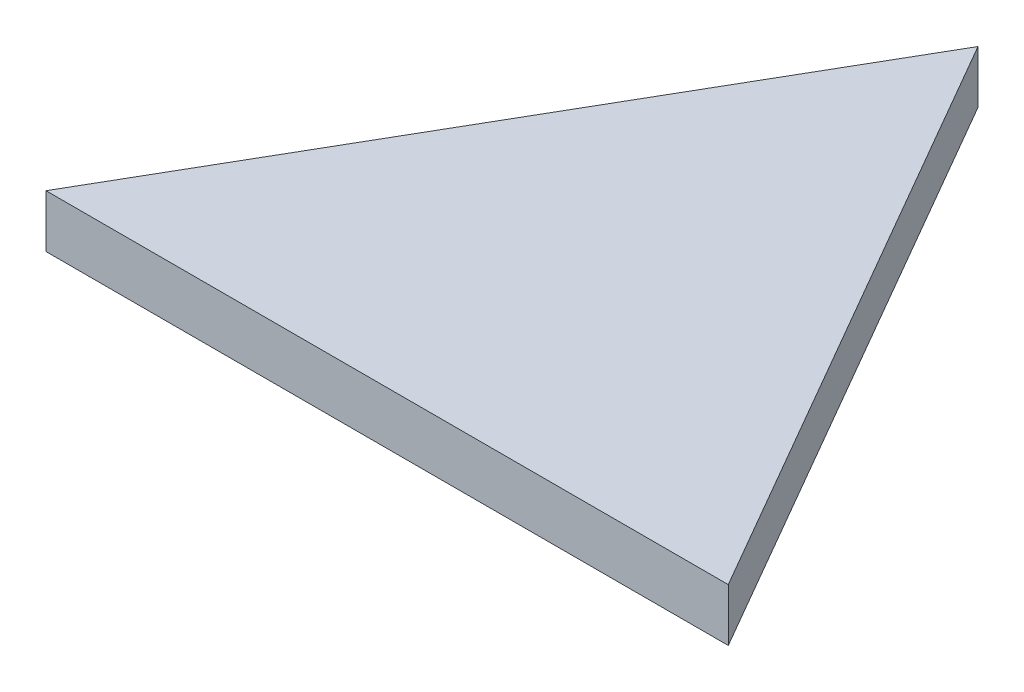
ISO-10303-21;
HEADER;
FILE_DESCRIPTION(('STEP AP214'),'2;1');
FILE_NAME('part.step','',(''),(''),'','','');
FILE_SCHEMA(('AUTOMOTIVE_DESIGN { 1 0 10303 214 1 1 1 1 }'));
ENDSEC;
DATA;
#1=APPLICATION_CONTEXT('core data for automotive mechanical design processes');
#2=APPLICATION_PROTOCOL_DEFINITION('international standard','automotive_design',2000,#1);
#3=PRODUCT_CONTEXT('',#1,'mechanical');
#4=PRODUCT('Part','Part','',(#3));
#5=PRODUCT_RELATED_PRODUCT_CATEGORY('part','',(#4));
#6=PRODUCT_DEFINITION_FORMATION('','',#4);
#7=PRODUCT_DEFINITION_CONTEXT('part definition',#1,'design');
#8=PRODUCT_DEFINITION('design','',#6,#7);
#9=PRODUCT_DEFINITION_SHAPE('','',#8);
#10=(LENGTH_UNIT() NAMED_UNIT(*) SI_UNIT(.MILLI.,.METRE.));
#11=(NAMED_UNIT(*) PLANE_ANGLE_UNIT() SI_UNIT($,.RADIAN.));
#12=(NAMED_UNIT(*) SI_UNIT($,.STERADIAN.) SOLID_ANGLE_UNIT());
#13=UNCERTAINTY_MEASURE_WITH_UNIT(LENGTH_MEASURE(1.E-05),#10,'distance_accuracy_value','');
#14=(GEOMETRIC_REPRESENTATION_CONTEXT(3) GLOBAL_UNCERTAINTY_ASSIGNED_CONTEXT((#13)) GLOBAL_UNIT_ASSIGNED_CONTEXT((#10,
#11,#12)) REPRESENTATION_CONTEXT('',''));
#15=CARTESIAN_POINT('',(0.,0.,0.));
#16=DIRECTION('',(0.,0.,1.));
#17=DIRECTION('',(1.,0.,0.));
#18=AXIS2_PLACEMENT_3D('',#15,#16,#17);
#19=CARTESIAN_POINT('',(68.4167130490525,17.,39.8507649226201));
#20=DIRECTION('',(-0.866025403784439,0.,0.5));
#21=DIRECTION('',(0.5,0.,0.866025403784439));
#22=AXIS2_PLACEMENT_3D('',#19,#20,#21);
#23=PLANE('',#22);
#24=DIRECTION('',(-0.5,0.,-0.866025403784439));
#25=VECTOR('',#24,1.);
#26=CARTESIAN_POINT('',(68.4167130490525,0.,39.8507649226201));
#27=LINE('',#26,#25);
#28=CARTESIAN_POINT('',(68.4167130490525,0.,39.8507649226201));
#29=VERTEX_POINT('',#28);
#30=CARTESIAN_POINT('',(-41.5832869509475,0.,-150.674823909956));
#31=VERTEX_POINT('',#30);
#32=EDGE_CURVE('E82',#29,#31,#27,.T.);
#33=ORIENTED_EDGE('',*,*,#32,.T.);
#34=DIRECTION('',(0.,-1.,0.));
#35=VECTOR('',#34,1.);
#36=CARTESIAN_POINT('',(-41.5832869509475,17.,-150.674823909956));
#37=LINE('',#36,#35);
#38=CARTESIAN_POINT('',(-41.5832869509475,17.,-150.674823909956));
#39=VERTEX_POINT('',#38);
#40=EDGE_CURVE('E11',#39,#31,#37,.T.);
#41=ORIENTED_EDGE('',*,*,#40,.F.);
#42=DIRECTION('',(-0.5,0.,-0.866025403784439));
#43=VECTOR('',#42,1.);
#44=CARTESIAN_POINT('',(68.4167130490525,17.,39.8507649226201));
#45=LINE('',#44,#43);
#46=CARTESIAN_POINT('',(68.4167130490525,17.,39.8507649226201));
#47=VERTEX_POINT('',#46);
#48=EDGE_CURVE('E75',#47,#39,#45,.T.);
#49=ORIENTED_EDGE('',*,*,#48,.F.);
#50=DIRECTION('',(0.,-1.,0.));
#51=VECTOR('',#50,1.);
#52=CARTESIAN_POINT('',(68.4167130490525,17.,39.8507649226201));
#53=LINE('',#52,#51);
#54=EDGE_CURVE('E83',#47,#29,#53,.T.);
#55=ORIENTED_EDGE('',*,*,#54,.T.);
#56=EDGE_LOOP('',(#33,#41,#49,#55));
#57=FACE_BOUND('',#56,.T.);
#58=ADVANCED_FACE('F35',(#57),#23,.F.);
#59=CARTESIAN_POINT('',(-41.5832869509475,17.,-150.674823909956));
#60=DIRECTION('',(0.866025403784439,0.,0.5));
#61=DIRECTION('',(0.5,0.,-0.866025403784439));
#62=AXIS2_PLACEMENT_3D('',#59,#60,#61);
#63=PLANE('',#62);
#64=DIRECTION('',(-0.5,0.,0.866025403784439));
#65=VECTOR('',#64,1.);
#66=CARTESIAN_POINT('',(-41.5832869509475,0.,-150.674823909956));
#67=LINE('',#66,#65);
#68=CARTESIAN_POINT('',(-151.583286950947,0.,39.8507649226201));
#69=VERTEX_POINT('',#68);
#70=EDGE_CURVE('E63',#31,#69,#67,.T.);
#71=ORIENTED_EDGE('',*,*,#70,.T.);
#72=DIRECTION('',(0.,-1.,0.));
#73=VECTOR('',#72,1.);
#74=CARTESIAN_POINT('',(-151.583286950947,17.,39.8507649226201));
#75=LINE('',#74,#73);
#76=CARTESIAN_POINT('',(-151.583286950947,17.,39.8507649226201));
#77=VERTEX_POINT('',#76);
#78=EDGE_CURVE('E43',#77,#69,#75,.T.);
#79=ORIENTED_EDGE('',*,*,#78,.F.);
#80=DIRECTION('',(-0.5,0.,0.866025403784439));
#81=VECTOR('',#80,1.);
#82=CARTESIAN_POINT('',(-41.5832869509475,17.,-150.674823909956));
#83=LINE('',#82,#81);
#84=EDGE_CURVE('E71',#39,#77,#83,.T.);
#85=ORIENTED_EDGE('',*,*,#84,.F.);
#86=ORIENTED_EDGE('',*,*,#40,.T.);
#87=EDGE_LOOP('',(#71,#79,#85,#86));
#88=FACE_BOUND('',#87,.T.);
#89=ADVANCED_FACE('F72',(#88),#63,.F.);
#90=CARTESIAN_POINT('',(-151.583286950947,17.,39.8507649226201));
#91=DIRECTION('',(0.,0.,-1.));
#92=DIRECTION('',(-1.,0.,0.));
#93=AXIS2_PLACEMENT_3D('',#90,#91,#92);
#94=PLANE('',#93);
#95=DIRECTION('',(1.,0.,0.));
#96=VECTOR('',#95,1.);
#97=CARTESIAN_POINT('',(-151.583286950947,0.,39.8507649226201));
#98=LINE('',#97,#96);
#99=EDGE_CURVE('E68',#69,#29,#98,.T.);
#100=ORIENTED_EDGE('',*,*,#99,.T.);
#101=ORIENTED_EDGE('',*,*,#54,.F.);
#102=DIRECTION('',(1.,0.,0.));
#103=VECTOR('',#102,1.);
#104=CARTESIAN_POINT('',(-151.583286950947,17.,39.8507649226201));
#105=LINE('',#104,#103);
#106=EDGE_CURVE('E51',#77,#47,#105,.T.);
#107=ORIENTED_EDGE('',*,*,#106,.F.);
#108=ORIENTED_EDGE('',*,*,#78,.T.);
#109=EDGE_LOOP('',(#100,#101,#107,#108));
#110=FACE_BOUND('',#109,.T.);
#111=ADVANCED_FACE('F94',(#110),#94,.F.);
#112=CARTESIAN_POINT('',(0.,17.,0.));
#113=DIRECTION('',(0.,1.,0.));
#114=DIRECTION('',(0.,0.,1.));
#115=AXIS2_PLACEMENT_3D('',#112,#113,#114);
#116=PLANE('',#115);
#117=ORIENTED_EDGE('',*,*,#48,.T.);
#118=ORIENTED_EDGE('',*,*,#84,.T.);
#119=ORIENTED_EDGE('',*,*,#106,.T.);
#120=EDGE_LOOP('',(#117,#118,#119));
#121=FACE_BOUND('',#120,.T.);
#122=ADVANCED_FACE('F78',(#121),#116,.T.);
#123=CARTESIAN_POINT('',(0.,0.,0.));
#124=DIRECTION('',(0.,1.,0.));
#125=DIRECTION('',(0.,0.,1.));
#126=AXIS2_PLACEMENT_3D('',#123,#124,#125);
#127=PLANE('',#126);
#128=CARTESIAN_POINT('',(-145.521109124456,0.,36.3507649226202));
#129=DIRECTION('',(0.,-1.,0.));
#130=DIRECTION('',(0.,0.,-1.));
#131=AXIS2_PLACEMENT_3D('',#128,#129,#130);
#132=CIRCLE('',#131,2.);
#133=CARTESIAN_POINT('',(-145.521109124456,0.,34.3507649226202));
#134=VERTEX_POINT('',#133);
#135=EDGE_CURVE('E89',#134,#134,#132,.T.);
#136=ORIENTED_EDGE('',*,*,#135,.F.);
#137=EDGE_LOOP('',(#136));
#138=FACE_BOUND('',#137,.T.);
#139=CARTESIAN_POINT('',(62.3545352225615,0.,36.3507649226201));
#140=DIRECTION('',(0.,-1.,0.));
#141=DIRECTION('',(0.,0.,-1.));
#142=AXIS2_PLACEMENT_3D('',#139,#140,#141);
#143=CIRCLE('',#142,2.);
#144=CARTESIAN_POINT('',(62.3545352225615,0.,34.3507649226201));
#145=VERTEX_POINT('',#144);
#146=EDGE_CURVE('E193',#145,#145,#143,.T.);
#147=ORIENTED_EDGE('',*,*,#146,.F.);
#148=EDGE_LOOP('',(#147));
#149=FACE_BOUND('',#148,.T.);
#150=CARTESIAN_POINT('',(-41.5832869509475,0.,-143.674823909956));
#151=DIRECTION('',(0.,-1.,0.));
#152=DIRECTION('',(0.,0.,-1.));
#153=AXIS2_PLACEMENT_3D('',#150,#151,#152);
#154=CIRCLE('',#153,2.);
#155=CARTESIAN_POINT('',(-41.5832869509475,0.,-145.674823909956));
#156=VERTEX_POINT('',#155);
#157=EDGE_CURVE('E201',#156,#156,#154,.T.);
#158=ORIENTED_EDGE('',*,*,#157,.F.);
#159=EDGE_LOOP('',(#158));
#160=FACE_BOUND('',#159,.T.);
#161=ORIENTED_EDGE('',*,*,#32,.F.);
#162=ORIENTED_EDGE('',*,*,#99,.F.);
#163=ORIENTED_EDGE('',*,*,#70,.F.);
#164=EDGE_LOOP('',(#161,#162,#163));
#165=FACE_BOUND('',#164,.T.);
#166=ADVANCED_FACE('F95',(#138,#149,#160,#165),#127,.F.);
#167=CARTESIAN_POINT('',(-41.5832869509475,14.,-143.674823909956));
#168=DIRECTION('',(0.,-1.,0.));
#169=DIRECTION('',(0.,0.,-1.));
#170=AXIS2_PLACEMENT_3D('',#167,#168,#169);
#171=CYLINDRICAL_SURFACE('',#170,2.);
#172=CARTESIAN_POINT('',(-41.5832869509475,14.,-143.674823909956));
#173=DIRECTION('',(0.,-1.,0.));
#174=DIRECTION('',(0.,0.,-1.));
#175=AXIS2_PLACEMENT_3D('',#172,#173,#174);
#176=CIRCLE('',#175,2.);
#177=CARTESIAN_POINT('',(-41.5832869509475,14.,-145.674823909956));
#178=VERTEX_POINT('',#177);
#179=EDGE_CURVE('E198',#178,#178,#176,.T.);
#180=ORIENTED_EDGE('',*,*,#179,.F.);
#181=EDGE_LOOP('',(#180));
#182=FACE_BOUND('',#181,.T.);
#183=ORIENTED_EDGE('',*,*,#157,.T.);
#184=EDGE_LOOP('',(#183));
#185=FACE_BOUND('',#184,.T.);
#186=ADVANCED_FACE('F97',(#182,#185),#171,.F.);
#187=CARTESIAN_POINT('',(-41.5832869509475,14.,-143.674823909956));
#188=DIRECTION('',(0.,-1.,0.));
#189=DIRECTION('',(0.,0.,-1.));
#190=AXIS2_PLACEMENT_3D('',#187,#188,#189);
#191=PLANE('',#190);
#192=ORIENTED_EDGE('',*,*,#179,.T.);
#193=EDGE_LOOP('',(#192));
#194=FACE_BOUND('',#193,.T.);
#195=ADVANCED_FACE('F104',(#194),#191,.T.);
#196=CARTESIAN_POINT('',(62.3545352225615,14.,36.3507649226201));
#197=DIRECTION('',(0.,-1.,0.));
#198=DIRECTION('',(0.,0.,-1.));
#199=AXIS2_PLACEMENT_3D('',#196,#197,#198);
#200=CYLINDRICAL_SURFACE('',#199,2.);
#201=CARTESIAN_POINT('',(62.3545352225615,14.,36.3507649226201));
#202=DIRECTION('',(0.,-1.,0.));
#203=DIRECTION('',(0.,0.,-1.));
#204=AXIS2_PLACEMENT_3D('',#201,#202,#203);
#205=CIRCLE('',#204,2.);
#206=CARTESIAN_POINT('',(62.3545352225615,14.,34.3507649226201));
#207=VERTEX_POINT('',#206);
#208=EDGE_CURVE('E190',#207,#207,#205,.T.);
#209=ORIENTED_EDGE('',*,*,#208,.F.);
#210=EDGE_LOOP('',(#209));
#211=FACE_BOUND('',#210,.T.);
#212=ORIENTED_EDGE('',*,*,#146,.T.);
#213=EDGE_LOOP('',(#212));
#214=FACE_BOUND('',#213,.T.);
#215=ADVANCED_FACE('F143',(#211,#214),#200,.F.);
#216=CARTESIAN_POINT('',(62.3545352225615,14.,36.3507649226201));
#217=DIRECTION('',(0.,-1.,0.));
#218=DIRECTION('',(0.,0.,-1.));
#219=AXIS2_PLACEMENT_3D('',#216,#217,#218);
#220=PLANE('',#219);
#221=ORIENTED_EDGE('',*,*,#208,.T.);
#222=EDGE_LOOP('',(#221));
#223=FACE_BOUND('',#222,.T.);
#224=ADVANCED_FACE('F153',(#223),#220,.T.);
#225=CARTESIAN_POINT('',(-145.521109124456,14.,36.3507649226202));
#226=DIRECTION('',(0.,-1.,0.));
#227=DIRECTION('',(0.,0.,-1.));
#228=AXIS2_PLACEMENT_3D('',#225,#226,#227);
#229=CYLINDRICAL_SURFACE('',#228,2.);
#230=CARTESIAN_POINT('',(-145.521109124456,14.,36.3507649226202));
#231=DIRECTION('',(0.,-1.,0.));
#232=DIRECTION('',(0.,0.,-1.));
#233=AXIS2_PLACEMENT_3D('',#230,#231,#232);
#234=CIRCLE('',#233,2.);
#235=CARTESIAN_POINT('',(-145.521109124456,14.,34.3507649226202));
#236=VERTEX_POINT('',#235);
#237=EDGE_CURVE('E85',#236,#236,#234,.T.);
#238=ORIENTED_EDGE('',*,*,#237,.F.);
#239=EDGE_LOOP('',(#238));
#240=FACE_BOUND('',#239,.T.);
#241=ORIENTED_EDGE('',*,*,#135,.T.);
#242=EDGE_LOOP('',(#241));
#243=FACE_BOUND('',#242,.T.);
#244=ADVANCED_FACE('F163',(#240,#243),#229,.F.);
#245=CARTESIAN_POINT('',(-145.521109124456,14.,36.3507649226202));
#246=DIRECTION('',(0.,-1.,0.));
#247=DIRECTION('',(0.,0.,-1.));
#248=AXIS2_PLACEMENT_3D('',#245,#246,#247);
#249=PLANE('',#248);
#250=ORIENTED_EDGE('',*,*,#237,.T.);
#251=EDGE_LOOP('',(#250));
#252=FACE_BOUND('',#251,.T.);
#253=ADVANCED_FACE('F173',(#252),#249,.T.);
#254=CLOSED_SHELL('',(#58,#89,#111,#122,#166,#186,#195,#215,#224,#244,#253));
#255=MANIFOLD_SOLID_BREP('B2',#254);
#256=ADVANCED_BREP_SHAPE_REPRESENTATION('',(#18,#255),#14);
#257=SHAPE_DEFINITION_REPRESENTATION(#9,#256);
ENDSEC;
END-ISO-10303-21;
